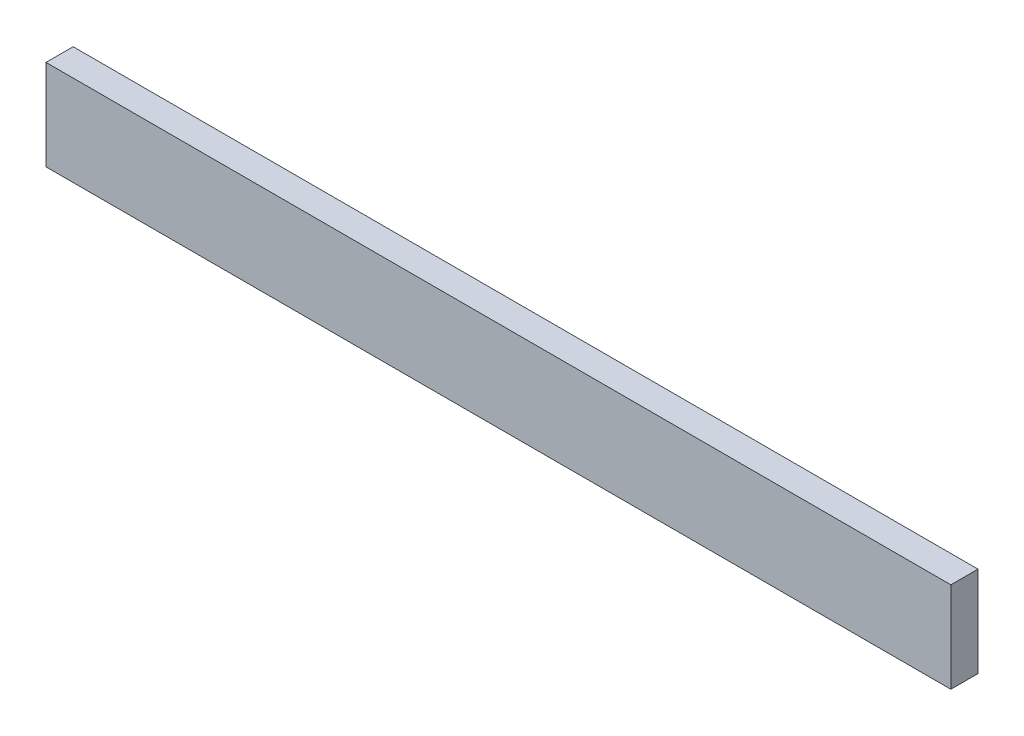
ISO-10303-21;
HEADER;
FILE_DESCRIPTION(('STEP AP214'),'2;1');
FILE_NAME('part.step','',(''),(''),'','','');
FILE_SCHEMA(('AUTOMOTIVE_DESIGN { 1 0 10303 214 1 1 1 1 }'));
ENDSEC;
DATA;
#1=APPLICATION_CONTEXT('core data for automotive mechanical design processes');
#2=APPLICATION_PROTOCOL_DEFINITION('international standard','automotive_design',2000,#1);
#3=PRODUCT_CONTEXT('',#1,'mechanical');
#4=PRODUCT('Part','Part','',(#3));
#5=PRODUCT_RELATED_PRODUCT_CATEGORY('part','',(#4));
#6=PRODUCT_DEFINITION_FORMATION('','',#4);
#7=PRODUCT_DEFINITION_CONTEXT('part definition',#1,'design');
#8=PRODUCT_DEFINITION('design','',#6,#7);
#9=PRODUCT_DEFINITION_SHAPE('','',#8);
#10=(LENGTH_UNIT() NAMED_UNIT(*) SI_UNIT(.MILLI.,.METRE.));
#11=(NAMED_UNIT(*) PLANE_ANGLE_UNIT() SI_UNIT($,.RADIAN.));
#12=(NAMED_UNIT(*) SI_UNIT($,.STERADIAN.) SOLID_ANGLE_UNIT());
#13=UNCERTAINTY_MEASURE_WITH_UNIT(LENGTH_MEASURE(1.E-05),#10,'distance_accuracy_value','');
#14=(GEOMETRIC_REPRESENTATION_CONTEXT(3) GLOBAL_UNCERTAINTY_ASSIGNED_CONTEXT((#13)) GLOBAL_UNIT_ASSIGNED_CONTEXT((#10,
#11,#12)) REPRESENTATION_CONTEXT('',''));
#15=CARTESIAN_POINT('',(0.,0.,0.));
#16=DIRECTION('',(0.,0.,1.));
#17=DIRECTION('',(1.,0.,0.));
#18=AXIS2_PLACEMENT_3D('',#15,#16,#17);
#19=CARTESIAN_POINT('',(0.,0.,3.));
#20=DIRECTION('',(1.,0.,0.));
#21=DIRECTION('',(0.,1.,0.));
#22=AXIS2_PLACEMENT_3D('',#19,#20,#21);
#23=PLANE('',#22);
#24=DIRECTION('',(0.,-1.,0.));
#25=VECTOR('',#24,1.);
#26=CARTESIAN_POINT('',(0.,0.,0.));
#27=LINE('',#26,#25);
#28=CARTESIAN_POINT('',(0.,10.,0.));
#29=VERTEX_POINT('',#28);
#30=CARTESIAN_POINT('',(0.,0.,0.));
#31=VERTEX_POINT('',#30);
#32=EDGE_CURVE('E99',#29,#31,#27,.T.);
#33=ORIENTED_EDGE('',*,*,#32,.T.);
#34=DIRECTION('',(0.,0.,-1.));
#35=VECTOR('',#34,1.);
#36=CARTESIAN_POINT('',(0.,0.,3.));
#37=LINE('',#36,#35);
#38=CARTESIAN_POINT('',(0.,0.,3.));
#39=VERTEX_POINT('',#38);
#40=EDGE_CURVE('E11',#39,#31,#37,.T.);
#41=ORIENTED_EDGE('',*,*,#40,.F.);
#42=DIRECTION('',(0.,-1.,0.));
#43=VECTOR('',#42,1.);
#44=CARTESIAN_POINT('',(0.,0.,3.));
#45=LINE('',#44,#43);
#46=CARTESIAN_POINT('',(0.,10.,3.));
#47=VERTEX_POINT('',#46);
#48=EDGE_CURVE('E87',#47,#39,#45,.T.);
#49=ORIENTED_EDGE('',*,*,#48,.F.);
#50=DIRECTION('',(0.,0.,-1.));
#51=VECTOR('',#50,1.);
#52=CARTESIAN_POINT('',(0.,10.,3.));
#53=LINE('',#52,#51);
#54=EDGE_CURVE('E95',#47,#29,#53,.T.);
#55=ORIENTED_EDGE('',*,*,#54,.T.);
#56=EDGE_LOOP('',(#33,#41,#49,#55));
#57=FACE_BOUND('',#56,.T.);
#58=ADVANCED_FACE('F36',(#57),#23,.F.);
#59=CARTESIAN_POINT('',(0.,0.,3.));
#60=DIRECTION('',(0.,1.,0.));
#61=DIRECTION('',(0.,0.,1.));
#62=AXIS2_PLACEMENT_3D('',#59,#60,#61);
#63=PLANE('',#62);
#64=DIRECTION('',(1.,0.,0.));
#65=VECTOR('',#64,1.);
#66=CARTESIAN_POINT('',(0.,0.,0.));
#67=LINE('',#66,#65);
#68=CARTESIAN_POINT('',(100.,0.,0.));
#69=VERTEX_POINT('',#68);
#70=EDGE_CURVE('E91',#31,#69,#67,.T.);
#71=ORIENTED_EDGE('',*,*,#70,.T.);
#72=DIRECTION('',(0.,0.,-1.));
#73=VECTOR('',#72,1.);
#74=CARTESIAN_POINT('',(100.,0.,3.));
#75=LINE('',#74,#73);
#76=CARTESIAN_POINT('',(100.,0.,3.));
#77=VERTEX_POINT('',#76);
#78=EDGE_CURVE('E44',#77,#69,#75,.T.);
#79=ORIENTED_EDGE('',*,*,#78,.F.);
#80=DIRECTION('',(1.,0.,0.));
#81=VECTOR('',#80,1.);
#82=CARTESIAN_POINT('',(0.,0.,3.));
#83=LINE('',#82,#81);
#84=EDGE_CURVE('E82',#39,#77,#83,.T.);
#85=ORIENTED_EDGE('',*,*,#84,.F.);
#86=ORIENTED_EDGE('',*,*,#40,.T.);
#87=EDGE_LOOP('',(#71,#79,#85,#86));
#88=FACE_BOUND('',#87,.T.);
#89=ADVANCED_FACE('F90',(#88),#63,.F.);
#90=CARTESIAN_POINT('',(100.,0.,3.));
#91=DIRECTION('',(-1.,0.,0.));
#92=DIRECTION('',(0.,-1.,0.));
#93=AXIS2_PLACEMENT_3D('',#90,#91,#92);
#94=PLANE('',#93);
#95=DIRECTION('',(0.,1.,0.));
#96=VECTOR('',#95,1.);
#97=CARTESIAN_POINT('',(100.,0.,0.));
#98=LINE('',#97,#96);
#99=CARTESIAN_POINT('',(100.,10.,0.));
#100=VERTEX_POINT('',#99);
#101=EDGE_CURVE('E69',#69,#100,#98,.T.);
#102=ORIENTED_EDGE('',*,*,#101,.T.);
#103=DIRECTION('',(0.,0.,-1.));
#104=VECTOR('',#103,1.);
#105=CARTESIAN_POINT('',(100.,10.,3.));
#106=LINE('',#105,#104);
#107=CARTESIAN_POINT('',(100.,10.,3.));
#108=VERTEX_POINT('',#107);
#109=EDGE_CURVE('E92',#108,#100,#106,.T.);
#110=ORIENTED_EDGE('',*,*,#109,.F.);
#111=DIRECTION('',(0.,1.,0.));
#112=VECTOR('',#111,1.);
#113=CARTESIAN_POINT('',(100.,0.,3.));
#114=LINE('',#113,#112);
#115=EDGE_CURVE('E85',#77,#108,#114,.T.);
#116=ORIENTED_EDGE('',*,*,#115,.F.);
#117=ORIENTED_EDGE('',*,*,#78,.T.);
#118=EDGE_LOOP('',(#102,#110,#116,#117));
#119=FACE_BOUND('',#118,.T.);
#120=ADVANCED_FACE('F93',(#119),#94,.F.);
#121=CARTESIAN_POINT('',(0.,10.,3.));
#122=DIRECTION('',(0.,-1.,0.));
#123=DIRECTION('',(0.,0.,-1.));
#124=AXIS2_PLACEMENT_3D('',#121,#122,#123);
#125=PLANE('',#124);
#126=DIRECTION('',(-1.,0.,0.));
#127=VECTOR('',#126,1.);
#128=CARTESIAN_POINT('',(0.,10.,0.));
#129=LINE('',#128,#127);
#130=EDGE_CURVE('E75',#100,#29,#129,.T.);
#131=ORIENTED_EDGE('',*,*,#130,.T.);
#132=ORIENTED_EDGE('',*,*,#54,.F.);
#133=DIRECTION('',(-1.,0.,0.));
#134=VECTOR('',#133,1.);
#135=CARTESIAN_POINT('',(0.,10.,3.));
#136=LINE('',#135,#134);
#137=EDGE_CURVE('E52',#108,#47,#136,.T.);
#138=ORIENTED_EDGE('',*,*,#137,.F.);
#139=ORIENTED_EDGE('',*,*,#109,.T.);
#140=EDGE_LOOP('',(#131,#132,#138,#139));
#141=FACE_BOUND('',#140,.T.);
#142=ADVANCED_FACE('F106',(#141),#125,.F.);
#143=CARTESIAN_POINT('',(0.,0.,3.));
#144=DIRECTION('',(0.,0.,-1.));
#145=DIRECTION('',(-1.,0.,0.));
#146=AXIS2_PLACEMENT_3D('',#143,#144,#145);
#147=PLANE('',#146);
#148=ORIENTED_EDGE('',*,*,#48,.T.);
#149=ORIENTED_EDGE('',*,*,#84,.T.);
#150=ORIENTED_EDGE('',*,*,#115,.T.);
#151=ORIENTED_EDGE('',*,*,#137,.T.);
#152=EDGE_LOOP('',(#148,#149,#150,#151));
#153=FACE_BOUND('',#152,.T.);
#154=ADVANCED_FACE('F83',(#153),#147,.F.);
#155=CARTESIAN_POINT('',(0.,0.,0.));
#156=DIRECTION('',(0.,0.,-1.));
#157=DIRECTION('',(-1.,0.,0.));
#158=AXIS2_PLACEMENT_3D('',#155,#156,#157);
#159=PLANE('',#158);
#160=ORIENTED_EDGE('',*,*,#32,.F.);
#161=ORIENTED_EDGE('',*,*,#130,.F.);
#162=ORIENTED_EDGE('',*,*,#101,.F.);
#163=ORIENTED_EDGE('',*,*,#70,.F.);
#164=EDGE_LOOP('',(#160,#161,#162,#163));
#165=FACE_BOUND('',#164,.T.);
#166=ADVANCED_FACE('F109',(#165),#159,.T.);
#167=CLOSED_SHELL('',(#58,#89,#120,#142,#154,#166));
#168=MANIFOLD_SOLID_BREP('B2',#167);
#169=ADVANCED_BREP_SHAPE_REPRESENTATION('',(#18,#168),#14);
#170=SHAPE_DEFINITION_REPRESENTATION(#9,#169);
ENDSEC;
END-ISO-10303-21;
